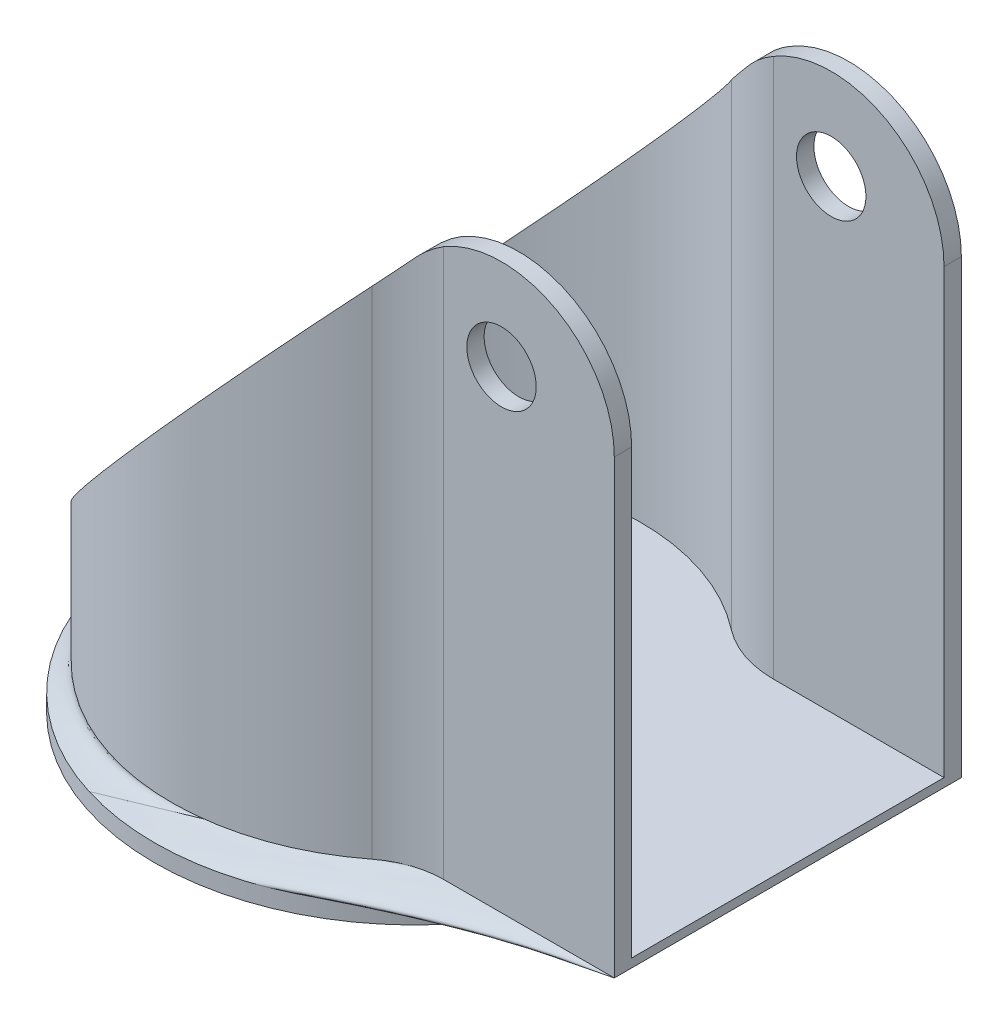
ISO-10303-21;
HEADER;
FILE_DESCRIPTION(('STEP AP214'),'2;1');
FILE_NAME('part.step','',(''),(''),'','','');
FILE_SCHEMA(('AUTOMOTIVE_DESIGN { 1 0 10303 214 1 1 1 1 }'));
ENDSEC;
DATA;
#1=APPLICATION_CONTEXT('core data for automotive mechanical design processes');
#2=APPLICATION_PROTOCOL_DEFINITION('international standard','automotive_design',2000,#1);
#3=PRODUCT_CONTEXT('',#1,'mechanical');
#4=PRODUCT('Part','Part','',(#3));
#5=PRODUCT_RELATED_PRODUCT_CATEGORY('part','',(#4));
#6=PRODUCT_DEFINITION_FORMATION('','',#4);
#7=PRODUCT_DEFINITION_CONTEXT('part definition',#1,'design');
#8=PRODUCT_DEFINITION('design','',#6,#7);
#9=PRODUCT_DEFINITION_SHAPE('','',#8);
#10=(LENGTH_UNIT() NAMED_UNIT(*) SI_UNIT(.MILLI.,.METRE.));
#11=(NAMED_UNIT(*) PLANE_ANGLE_UNIT() SI_UNIT($,.RADIAN.));
#12=(NAMED_UNIT(*) SI_UNIT($,.STERADIAN.) SOLID_ANGLE_UNIT());
#13=UNCERTAINTY_MEASURE_WITH_UNIT(LENGTH_MEASURE(1.E-05),#10,'distance_accuracy_value','');
#14=(GEOMETRIC_REPRESENTATION_CONTEXT(3) GLOBAL_UNCERTAINTY_ASSIGNED_CONTEXT((#13)) GLOBAL_UNIT_ASSIGNED_CONTEXT((#10,
#11,#12)) REPRESENTATION_CONTEXT('',''));
#15=CARTESIAN_POINT('',(0.,0.,0.));
#16=DIRECTION('',(0.,0.,1.));
#17=DIRECTION('',(1.,0.,0.));
#18=AXIS2_PLACEMENT_3D('',#15,#16,#17);
#19=CARTESIAN_POINT('',(30.0000000000002,57.0000000000002,-47.));
#20=DIRECTION('',(0.,0.,1.));
#21=DIRECTION('',(1.,0.,0.));
#22=AXIS2_PLACEMENT_3D('',#19,#20,#21);
#23=CYLINDRICAL_SURFACE('',#22,12.9999999999998);
#24=CARTESIAN_POINT('',(30.0000000000002,57.0000000000002,-18.));
#25=DIRECTION('',(0.,0.,-1.));
#26=DIRECTION('',(-1.,0.,0.));
#27=AXIS2_PLACEMENT_3D('',#24,#25,#26);
#28=CIRCLE('',#27,12.9999999999998);
#29=CARTESIAN_POINT('',(43.,57.0000000000002,-18.));
#30=VERTEX_POINT('',#29);
#31=CARTESIAN_POINT('',(23.3238075793812,68.154750322749,-18.));
#32=VERTEX_POINT('',#31);
#33=EDGE_CURVE('E240',#30,#32,#28,.F.);
#34=ORIENTED_EDGE('',*,*,#33,.F.);
#35=DIRECTION('',(0.,0.,1.));
#36=VECTOR('',#35,1.);
#37=CARTESIAN_POINT('',(43.,57.0000000000002,-47.));
#38=LINE('',#37,#36);
#39=CARTESIAN_POINT('',(43.,57.0000000000002,-20.));
#40=VERTEX_POINT('',#39);
#41=EDGE_CURVE('E243',#40,#30,#38,.T.);
#42=ORIENTED_EDGE('',*,*,#41,.F.);
#43=CARTESIAN_POINT('',(30.0000000000002,57.0000000000002,-20.));
#44=DIRECTION('',(0.,0.,1.));
#45=DIRECTION('',(1.,0.,0.));
#46=AXIS2_PLACEMENT_3D('',#43,#44,#45);
#47=CIRCLE('',#46,12.9999999999998);
#48=CARTESIAN_POINT('',(23.3238075793812,68.154750322749,-20.));
#49=VERTEX_POINT('',#48);
#50=EDGE_CURVE('E281',#49,#40,#47,.F.);
#51=ORIENTED_EDGE('',*,*,#50,.F.);
#52=CARTESIAN_POINT('',(20.3380966836966,65.6975642743472,-20.4561260251725));
#53=CARTESIAN_POINT('',(20.5524970602329,65.9357687621417,-20.3890470300889));
#54=CARTESIAN_POINT('',(20.7765289762126,66.1668912741178,-20.3269027138963));
#55=CARTESIAN_POINT('',(21.2409611029351,66.6115363948415,-20.2164288788429));
#56=CARTESIAN_POINT('',(21.4812140120493,66.8251864125114,-20.1679915247904));
#57=CARTESIAN_POINT('',(21.978774824642,67.2354225187706,-20.0876665412612));
#58=CARTESIAN_POINT('',(22.2360877927109,67.4320034997401,-20.0557838513717));
#59=CARTESIAN_POINT('',(22.6344047375489,67.7132979996968,-20.0228918922476));
#60=CARTESIAN_POINT('',(22.7698208811694,67.8051512779193,-20.0144129180655));
#61=CARTESIAN_POINT('',(23.0442172194368,67.9838020011142,-20.0029659002475));
#62=CARTESIAN_POINT('',(23.1831982336388,68.070598268213,-19.9999991355782));
#63=CARTESIAN_POINT('',(23.3238075793812,68.154750322749,-20.));
#64=B_SPLINE_CURVE_WITH_KNOTS('',3,(#52,#53,#54,#55,#56,#57,#58,#59,#60,#61,#62,#63),
.UNSPECIFIED.,.F.,.F.,(4,2,2,2,2,4),(0.,0.982230132643767,1.95650323326304,2.93106687106712,
3.42242947228087,3.91390606734185),.UNSPECIFIED.);
#65=CARTESIAN_POINT('',(20.3380966836966,65.6975642743472,-20.4561260251725));
#66=VERTEX_POINT('',#65);
#67=EDGE_CURVE('E310',#66,#49,#64,.T.);
#68=ORIENTED_EDGE('',*,*,#67,.F.);
#69=DIRECTION('',(0.,0.,1.));
#70=VECTOR('',#69,1.);
#71=CARTESIAN_POINT('',(20.3380966836966,65.6975642743472,-47.));
#72=LINE('',#71,#70);
#73=CARTESIAN_POINT('',(20.3380966836966,65.6975642743472,-18.3773698997434));
#74=VERTEX_POINT('',#73);
#75=EDGE_CURVE('E144',#66,#74,#72,.T.);
#76=ORIENTED_EDGE('',*,*,#75,.T.);
#77=CARTESIAN_POINT('',(23.3238075793812,68.154750322749,-18.));
#78=CARTESIAN_POINT('',(23.1836567373893,68.0708715796085,-17.9999989490713));
#79=CARTESIAN_POINT('',(23.0451164468122,67.9843637951381,-18.0024555349407));
#80=CARTESIAN_POINT('',(22.7715214130594,67.8062818677364,-18.0119346806309));
#81=CARTESIAN_POINT('',(22.6364661069004,67.7147085507284,-18.0189564980972));
#82=CARTESIAN_POINT('',(22.2388496240951,67.4340423946446,-18.0462106909953));
#83=CARTESIAN_POINT('',(21.9817344117881,67.237742665774,-18.0726426997475));
#84=CARTESIAN_POINT('',(21.484014047585,66.8276136973816,-18.1392147856673));
#85=CARTESIAN_POINT('',(21.2434054409978,66.6137881465514,-18.1793519838806));
#86=CARTESIAN_POINT('',(20.7780007200761,66.1683887998919,-18.2707394423202));
#87=CARTESIAN_POINT('',(20.553333664504,65.9366962276557,-18.3220691274884));
#88=CARTESIAN_POINT('',(20.3380966836966,65.6975642743472,-18.3773698997434));
#89=B_SPLINE_CURVE_WITH_KNOTS('',3,(#77,#78,#79,#80,#81,#82,#83,#84,#85,#86,#87,#88),
.UNSPECIFIED.,.F.,.F.,(4,2,2,2,2,4),(0.,0.489896124544593,0.97971260675667,1.9520167501121,
2.92411677377907,3.9033536264852),.UNSPECIFIED.);
#90=EDGE_CURVE('E246',#32,#74,#89,.T.);
#91=ORIENTED_EDGE('',*,*,#90,.F.);
#92=EDGE_LOOP('',(#34,#42,#51,#68,#76,#91));
#93=FACE_BOUND('',#92,.T.);
#94=ADVANCED_FACE('F125',(#93),#23,.T.);
#95=CARTESIAN_POINT('',(23.323807579381,70.,20.));
#96=DIRECTION('',(0.,0.,-1.));
#97=DIRECTION('',(-1.,0.,0.));
#98=AXIS2_PLACEMENT_3D('',#95,#96,#97);
#99=PLANE('',#98);
#100=CARTESIAN_POINT('',(30.0000000000002,59.5,20.));
#101=DIRECTION('',(0.,0.,1.));
#102=DIRECTION('',(1.,0.,0.));
#103=AXIS2_PLACEMENT_3D('',#100,#101,#102);
#104=CIRCLE('',#103,3.99999999999981);
#105=CARTESIAN_POINT('',(34.,59.5,20.));
#106=VERTEX_POINT('',#105);
#107=EDGE_CURVE('E398',#106,#106,#104,.T.);
#108=ORIENTED_EDGE('',*,*,#107,.F.);
#109=EDGE_LOOP('',(#108));
#110=FACE_BOUND('',#109,.T.);
#111=DIRECTION('',(0.,-1.,0.));
#112=VECTOR('',#111,1.);
#113=CARTESIAN_POINT('',(43.,70.,20.));
#114=LINE('',#113,#112);
#115=CARTESIAN_POINT('',(43.,57.0000000000002,20.));
#116=VERTEX_POINT('',#115);
#117=CARTESIAN_POINT('',(43.,5.,20.));
#118=VERTEX_POINT('',#117);
#119=EDGE_CURVE('E347',#116,#118,#114,.T.);
#120=ORIENTED_EDGE('',*,*,#119,.F.);
#121=CARTESIAN_POINT('',(30.0000000000002,57.0000000000002,20.));
#122=DIRECTION('',(0.,0.,-1.));
#123=DIRECTION('',(-1.,0.,0.));
#124=AXIS2_PLACEMENT_3D('',#121,#122,#123);
#125=CIRCLE('',#124,12.9999999999998);
#126=CARTESIAN_POINT('',(23.323807579381,68.1547503227489,20.));
#127=VERTEX_POINT('',#126);
#128=EDGE_CURVE('E311',#116,#127,#125,.F.);
#129=ORIENTED_EDGE('',*,*,#128,.T.);
#130=DIRECTION('',(0.,-1.,0.));
#131=VECTOR('',#130,1.);
#132=CARTESIAN_POINT('',(23.323807579381,70.,20.));
#133=LINE('',#132,#131);
#134=CARTESIAN_POINT('',(23.323807579381,5.,20.));
#135=VERTEX_POINT('',#134);
#136=EDGE_CURVE('E345',#127,#135,#133,.T.);
#137=ORIENTED_EDGE('',*,*,#136,.T.);
#138=DIRECTION('',(1.,0.,0.));
#139=VECTOR('',#138,1.);
#140=CARTESIAN_POINT('',(43.,5.,20.));
#141=LINE('',#140,#139);
#142=EDGE_CURVE('E363',#135,#118,#141,.T.);
#143=ORIENTED_EDGE('',*,*,#142,.T.);
#144=EDGE_LOOP('',(#120,#129,#137,#143));
#145=FACE_BOUND('',#144,.T.);
#146=ADVANCED_FACE('F324',(#110,#145),#99,.F.);
#147=CARTESIAN_POINT('',(43.,70.,20.));
#148=DIRECTION('',(-1.,0.,0.));
#149=DIRECTION('',(0.,0.,1.));
#150=AXIS2_PLACEMENT_3D('',#147,#148,#149);
#151=PLANE('',#150);
#152=ORIENTED_EDGE('',*,*,#41,.T.);
#153=DIRECTION('',(0.,1.,0.));
#154=VECTOR('',#153,1.);
#155=CARTESIAN_POINT('',(43.,63.9282032302757,-18.));
#156=LINE('',#155,#154);
#157=CARTESIAN_POINT('',(43.,6.00000000000001,-18.));
#158=VERTEX_POINT('',#157);
#159=EDGE_CURVE('E253',#158,#30,#156,.T.);
#160=ORIENTED_EDGE('',*,*,#159,.F.);
#161=DIRECTION('',(0.,0.,-1.));
#162=VECTOR('',#161,1.);
#163=CARTESIAN_POINT('',(43.,6.00000000000001,-18.));
#164=LINE('',#163,#162);
#165=CARTESIAN_POINT('',(43.,6.00000000000001,18.));
#166=VERTEX_POINT('',#165);
#167=EDGE_CURVE('E261',#166,#158,#164,.T.);
#168=ORIENTED_EDGE('',*,*,#167,.F.);
#169=DIRECTION('',(0.,-1.,0.));
#170=VECTOR('',#169,1.);
#171=CARTESIAN_POINT('',(43.,6.00000000000001,18.));
#172=LINE('',#171,#170);
#173=CARTESIAN_POINT('',(43.,57.0000000000002,18.));
#174=VERTEX_POINT('',#173);
#175=EDGE_CURVE('E260',#174,#166,#172,.T.);
#176=ORIENTED_EDGE('',*,*,#175,.F.);
#177=EDGE_CURVE('E267',#174,#116,#38,.T.);
#178=ORIENTED_EDGE('',*,*,#177,.T.);
#179=ORIENTED_EDGE('',*,*,#119,.T.);
#180=DIRECTION('',(0.,0.,-1.));
#181=VECTOR('',#180,1.);
#182=CARTESIAN_POINT('',(43.,5.,20.));
#183=LINE('',#182,#181);
#184=CARTESIAN_POINT('',(43.,5.,-20.));
#185=VERTEX_POINT('',#184);
#186=EDGE_CURVE('E355',#118,#185,#183,.T.);
#187=ORIENTED_EDGE('',*,*,#186,.T.);
#188=DIRECTION('',(0.,-1.,0.));
#189=VECTOR('',#188,1.);
#190=CARTESIAN_POINT('',(43.,70.,-20.));
#191=LINE('',#190,#189);
#192=EDGE_CURVE('E266',#40,#185,#191,.T.);
#193=ORIENTED_EDGE('',*,*,#192,.F.);
#194=EDGE_LOOP('',(#152,#160,#168,#176,#178,#179,#187,#193));
#195=FACE_BOUND('',#194,.T.);
#196=ADVANCED_FACE('F264',(#195),#151,.F.);
#197=CARTESIAN_POINT('',(43.,70.,-20.));
#198=DIRECTION('',(0.,0.,1.));
#199=DIRECTION('',(1.,0.,0.));
#200=AXIS2_PLACEMENT_3D('',#197,#198,#199);
#201=PLANE('',#200);
#202=CARTESIAN_POINT('',(30.0000000000002,59.5,-20.));
#203=DIRECTION('',(0.,0.,1.));
#204=DIRECTION('',(1.,0.,0.));
#205=AXIS2_PLACEMENT_3D('',#202,#203,#204);
#206=CIRCLE('',#205,3.99999999999981);
#207=CARTESIAN_POINT('',(34.,59.5,-20.));
#208=VERTEX_POINT('',#207);
#209=EDGE_CURVE('E629',#208,#208,#206,.T.);
#210=ORIENTED_EDGE('',*,*,#209,.T.);
#211=EDGE_LOOP('',(#210));
#212=FACE_BOUND('',#211,.T.);
#213=DIRECTION('',(0.,-1.,0.));
#214=VECTOR('',#213,1.);
#215=CARTESIAN_POINT('',(23.3238075793812,70.,-20.));
#216=LINE('',#215,#214);
#217=CARTESIAN_POINT('',(23.3238075793812,5.,-20.));
#218=VERTEX_POINT('',#217);
#219=EDGE_CURVE('E403',#49,#218,#216,.T.);
#220=ORIENTED_EDGE('',*,*,#219,.F.);
#221=ORIENTED_EDGE('',*,*,#50,.T.);
#222=ORIENTED_EDGE('',*,*,#192,.T.);
#223=DIRECTION('',(-1.,0.,0.));
#224=VECTOR('',#223,1.);
#225=CARTESIAN_POINT('',(43.,5.,-20.));
#226=LINE('',#225,#224);
#227=EDGE_CURVE('E464',#185,#218,#226,.T.);
#228=ORIENTED_EDGE('',*,*,#227,.T.);
#229=EDGE_LOOP('',(#220,#221,#222,#228));
#230=FACE_BOUND('',#229,.T.);
#231=ADVANCED_FACE('F452',(#212,#230),#201,.F.);
#232=CARTESIAN_POINT('',(41.,-84.8115558164098,-18.));
#233=DIRECTION('',(0.,0.,-1.));
#234=DIRECTION('',(-1.,0.,0.));
#235=AXIS2_PLACEMENT_3D('',#232,#233,#234);
#236=PLANE('',#235);
#237=CARTESIAN_POINT('',(30.0000000000002,59.5,-18.));
#238=DIRECTION('',(0.,0.,-1.));
#239=DIRECTION('',(-1.,0.,0.));
#240=AXIS2_PLACEMENT_3D('',#237,#238,#239);
#241=CIRCLE('',#240,3.99999999999981);
#242=CARTESIAN_POINT('',(26.0000000000004,59.5,-18.));
#243=VERTEX_POINT('',#242);
#244=EDGE_CURVE('E397',#243,#243,#241,.T.);
#245=ORIENTED_EDGE('',*,*,#244,.T.);
#246=EDGE_LOOP('',(#245));
#247=FACE_BOUND('',#246,.T.);
#248=DIRECTION('',(1.,0.,0.));
#249=VECTOR('',#248,1.);
#250=CARTESIAN_POINT('',(41.,6.00000000000001,-18.));
#251=LINE('',#250,#249);
#252=CARTESIAN_POINT('',(23.3238075793812,6.00000000000001,-18.));
#253=VERTEX_POINT('',#252);
#254=EDGE_CURVE('E256',#253,#158,#251,.T.);
#255=ORIENTED_EDGE('',*,*,#254,.T.);
#256=ORIENTED_EDGE('',*,*,#159,.T.);
#257=ORIENTED_EDGE('',*,*,#33,.T.);
#258=DIRECTION('',(0.,1.,0.));
#259=VECTOR('',#258,1.);
#260=CARTESIAN_POINT('',(23.3238075793812,-84.8115558164098,-18.));
#261=LINE('',#260,#259);
#262=EDGE_CURVE('E646',#253,#32,#261,.T.);
#263=ORIENTED_EDGE('',*,*,#262,.F.);
#264=EDGE_LOOP('',(#255,#256,#257,#263));
#265=FACE_BOUND('',#264,.T.);
#266=ADVANCED_FACE('F254',(#247,#265),#236,.F.);
#267=CARTESIAN_POINT('',(23.323807579381,-84.8115558164098,18.));
#268=DIRECTION('',(0.,0.,1.));
#269=DIRECTION('',(1.,0.,0.));
#270=AXIS2_PLACEMENT_3D('',#267,#268,#269);
#271=PLANE('',#270);
#272=CARTESIAN_POINT('',(30.0000000000002,59.5,18.));
#273=DIRECTION('',(0.,0.,1.));
#274=DIRECTION('',(1.,0.,0.));
#275=AXIS2_PLACEMENT_3D('',#272,#273,#274);
#276=CIRCLE('',#275,3.99999999999981);
#277=CARTESIAN_POINT('',(34.,59.5,18.));
#278=VERTEX_POINT('',#277);
#279=EDGE_CURVE('E394',#278,#278,#276,.T.);
#280=ORIENTED_EDGE('',*,*,#279,.T.);
#281=EDGE_LOOP('',(#280));
#282=FACE_BOUND('',#281,.T.);
#283=DIRECTION('',(0.,1.,0.));
#284=VECTOR('',#283,1.);
#285=CARTESIAN_POINT('',(23.323807579381,-84.8115558164098,18.));
#286=LINE('',#285,#284);
#287=CARTESIAN_POINT('',(23.323807579381,6.00000000000001,18.));
#288=VERTEX_POINT('',#287);
#289=CARTESIAN_POINT('',(23.323807579381,68.1547503227489,18.));
#290=VERTEX_POINT('',#289);
#291=EDGE_CURVE('E632',#288,#290,#286,.T.);
#292=ORIENTED_EDGE('',*,*,#291,.T.);
#293=CARTESIAN_POINT('',(30.0000000000002,57.0000000000002,18.));
#294=DIRECTION('',(0.,0.,1.));
#295=DIRECTION('',(1.,0.,0.));
#296=AXIS2_PLACEMENT_3D('',#293,#294,#295);
#297=CIRCLE('',#296,12.9999999999998);
#298=EDGE_CURVE('E136',#290,#174,#297,.F.);
#299=ORIENTED_EDGE('',*,*,#298,.T.);
#300=ORIENTED_EDGE('',*,*,#175,.T.);
#301=DIRECTION('',(-1.,0.,0.));
#302=VECTOR('',#301,1.);
#303=CARTESIAN_POINT('',(23.323807579381,6.00000000000001,18.));
#304=LINE('',#303,#302);
#305=EDGE_CURVE('E404',#166,#288,#304,.T.);
#306=ORIENTED_EDGE('',*,*,#305,.T.);
#307=EDGE_LOOP('',(#292,#299,#300,#306));
#308=FACE_BOUND('',#307,.T.);
#309=ADVANCED_FACE('F554',(#282,#308),#271,.F.);
#310=CARTESIAN_POINT('',(0.,2.,0.));
#311=DIRECTION('',(0.,-1.,0.));
#312=DIRECTION('',(0.,0.,-1.));
#313=AXIS2_PLACEMENT_3D('',#310,#311,#312);
#314=CYLINDRICAL_SURFACE('',#313,30.);
#315=CARTESIAN_POINT('',(20.6385286101872,2.,21.7727154210605));
#316=CARTESIAN_POINT('',(21.1069114025686,1.9999967695155,21.3287743520194));
#317=CARTESIAN_POINT('',(21.5609242023266,1.99997112346635,20.8696791666405));
#318=CARTESIAN_POINT('',(22.4384385253687,1.99991262947502,19.9231643174299));
#319=CARTESIAN_POINT('',(22.8619387747766,1.99987978123239,19.435743472556));
#320=CARTESIAN_POINT('',(23.6766305944913,1.99984451806615,18.4345821277172));
#321=CARTESIAN_POINT('',(24.0678211115046,1.9998421041343,17.9208407705906));
#322=CARTESIAN_POINT('',(24.815393705186,1.99989235367969,16.8704126057517));
#323=CARTESIAN_POINT('',(25.1718538185949,1.99994489041369,16.3337813260949));
#324=CARTESIAN_POINT('',(25.849478348367,2.00005308499189,15.2387330482142));
#325=CARTESIAN_POINT('',(26.1706458300146,2.0001087425644,14.6803179477063));
#326=CARTESIAN_POINT('',(26.7763329001326,2.00017925365555,13.5440942398429));
#327=CARTESIAN_POINT('',(27.0608578145972,2.00019411311059,12.9662884663453));
#328=CARTESIAN_POINT('',(27.6746274692136,2.0001429219598,11.6114746519007));
#329=CARTESIAN_POINT('',(27.9903492996494,2.00005033168782,10.8282932546574));
#330=CARTESIAN_POINT('',(28.5546306167619,1.99988971301073,9.23822727663455));
#331=CARTESIAN_POINT('',(28.8031956075415,1.99982168259257,8.43134464439648));
#332=CARTESIAN_POINT('',(29.2313819186252,1.99982559753617,6.79980145521425));
#333=CARTESIAN_POINT('',(29.4110293232653,1.99989748987643,5.97514774943444));
#334=CARTESIAN_POINT('',(29.7002307111012,2.00002899665847,4.31362949329095));
#335=CARTESIAN_POINT('',(29.8097835280744,2.00008861089595,3.47676473999873));
#336=CARTESIAN_POINT('',(29.9580200432756,2.00007539255169,1.79672141804074));
#337=CARTESIAN_POINT('',(29.9966987400759,2.00000255062354,0.953542408007458));
#338=CARTESIAN_POINT('',(30.0028962170715,1.99999834364561,-0.733077040533055));
#339=CARTESIAN_POINT('',(29.9704149758918,2.00006697863833,-1.57651747911873));
#340=CARTESIAN_POINT('',(29.8345059063687,2.00009086897016,-3.25788406757792));
#341=CARTESIAN_POINT('',(29.7310596079176,2.00004609478404,-4.09580872452158));
#342=CARTESIAN_POINT('',(29.4539383808078,1.9999187802873,-5.75995167611574));
#343=CARTESIAN_POINT('',(29.2802644206262,1.99983624049748,-6.5861701320384));
#344=CARTESIAN_POINT('',(28.8638950770561,1.99981216739309,-8.22114955535164));
#345=CARTESIAN_POINT('',(28.621190098666,1.99987065368896,-9.02990807906493));
#346=CARTESIAN_POINT('',(28.0684742599397,2.00002790950797,-10.6241488789166));
#347=CARTESIAN_POINT('',(27.7584594295471,2.00012668140755,-11.4096297789917));
#348=CARTESIAN_POINT('',(27.0735216288734,2.00020128280977,-12.951278523024));
#349=CARTESIAN_POINT('',(26.6986305549468,2.00017717256239,-13.7074605491955));
#350=CARTESIAN_POINT('',(25.8865358488253,2.00006559615334,-15.1854499033137));
#351=CARTESIAN_POINT('',(25.4493467034478,1.99997814470182,-15.9072651710032));
#352=CARTESIAN_POINT('',(24.6703871852089,1.99988190996921,-17.0789427819094));
#353=CARTESIAN_POINT('',(24.3449273532623,1.9998566692983,-17.5397437553378));
#354=CARTESIAN_POINT('',(23.6686056594756,1.9998440905068,-18.442205159054));
#355=CARTESIAN_POINT('',(23.3177490892267,1.99985674451264,-18.8838695461036));
#356=CARTESIAN_POINT('',(22.592202006359,1.99989893883841,-19.7461238671711));
#357=CARTESIAN_POINT('',(22.2175447407068,1.99992845604406,-20.1667417929068));
#358=CARTESIAN_POINT('',(21.4450836640818,1.99997797275445,-20.9863246895821));
#359=CARTESIAN_POINT('',(21.0472749910135,1.99999797025178,-21.3852850779084));
#360=CARTESIAN_POINT('',(20.6385286143832,2.,-21.7727154170831));
#361=B_SPLINE_CURVE_WITH_KNOTS('',3,(#315,#316,#317,#318,#319,#320,#321,#322,#323,#324,#325,
#326,#327,#328,#329,#330,#331,#332,#333,#334,#335,#336,#337,#338,#339,#340,#341,#342,#343,#344,
#345,#346,#347,#348,#349,#350,#351,#352,#353,#354,#355,#356,#357,#358,#359,#360),.UNSPECIFIED.,
.F.,.F.,(4,2,2,2,2,2,2,2,2,2,2,2,2,2,2,2,2,2,2,2,2,2,4),(0.,1.93568308827365,3.87144694309623,
5.80727387870067,7.73864567203558,9.66984958638858,11.6007724828395,14.1309146428023,
16.6608493720595,19.1898256096996,21.7188439229513,24.2480406964773,26.7772382297173,
29.3070942882205,31.8369154598434,34.3670884372364,36.8974106893501,39.4264924265918,
41.9549870070393,43.6466114721973,45.3378844843049,47.026844821845,48.716161151972),.UNSPECIFIED.);
#362=CARTESIAN_POINT('',(20.6385519370444,2.,21.7727400298412));
#363=VERTEX_POINT('',#362);
#364=CARTESIAN_POINT('',(20.6385583290229,2.,-21.7727467646857));
#365=VERTEX_POINT('',#364);
#366=EDGE_CURVE('E399',#363,#365,#361,.T.);
#367=ORIENTED_EDGE('',*,*,#366,.F.);
#368=CARTESIAN_POINT('',(0.,2.,0.));
#369=DIRECTION('',(0.,1.,0.));
#370=DIRECTION('',(0.,0.,1.));
#371=AXIS2_PLACEMENT_3D('',#368,#369,#370);
#372=CIRCLE('',#371,30.);
#373=CARTESIAN_POINT('',(-8.88685484436569,2.,28.6536954476507));
#374=VERTEX_POINT('',#373);
#375=EDGE_CURVE('E152',#374,#363,#372,.T.);
#376=ORIENTED_EDGE('',*,*,#375,.F.);
#377=EDGE_CURVE('E537',#365,#374,#372,.T.);
#378=ORIENTED_EDGE('',*,*,#377,.F.);
#379=EDGE_LOOP('',(#367,#376,#378));
#380=FACE_BOUND('',#379,.T.);
#381=CARTESIAN_POINT('',(0.,0.,0.));
#382=DIRECTION('',(0.,1.,0.));
#383=DIRECTION('',(0.,0.,1.));
#384=AXIS2_PLACEMENT_3D('',#381,#382,#383);
#385=CIRCLE('',#384,30.);
#386=CARTESIAN_POINT('',(0.,0.,30.));
#387=VERTEX_POINT('',#386);
#388=EDGE_CURVE('E385',#387,#387,#385,.T.);
#389=ORIENTED_EDGE('',*,*,#388,.T.);
#390=EDGE_LOOP('',(#389));
#391=FACE_BOUND('',#390,.T.);
#392=ADVANCED_FACE('F127',(#380,#391),#314,.T.);
#393=CARTESIAN_POINT('',(0.,0.,0.));
#394=DIRECTION('',(0.,1.,0.));
#395=DIRECTION('',(0.,0.,1.));
#396=AXIS2_PLACEMENT_3D('',#393,#394,#395);
#397=PLANE('',#396);
#398=ORIENTED_EDGE('',*,*,#388,.F.);
#399=EDGE_LOOP('',(#398));
#400=FACE_BOUND('',#399,.T.);
#401=ADVANCED_FACE('F491',(#400),#397,.F.);
#402=CARTESIAN_POINT('',(-8.88680323222086,2.,28.6535290725556));
#403=CARTESIAN_POINT('',(17.185963479544,5.,22.1052631578947));
#404=CARTESIAN_POINT('',(-8.25289266810883,2.,28.850134469253));
#405=CARTESIAN_POINT('',(17.6193037137746,5.,21.7683583499081));
#406=CARTESIAN_POINT('',(-6.97428043524823,2.,29.2005823997202));
#407=CARTESIAN_POINT('',(18.5437645353727,5.,21.1644360300766));
#408=CARTESIAN_POINT('',(-5.02924570834986,2.,29.5976187468163));
#409=CARTESIAN_POINT('',(20.0645230152562,5.,20.4976342474877));
#410=CARTESIAN_POINT('',(-3.06223423345898,2.,29.865319713202));
#411=CARTESIAN_POINT('',(21.6743943538667,5.,20.0906388611232));
#412=CARTESIAN_POINT('',(-1.73963030008314,2.,29.9568720447302));
#413=CARTESIAN_POINT('',(22.7749099493558,5.,20.));
#414=CARTESIAN_POINT('',(0.907168506355743,2.,30.051896721336));
#415=CARTESIAN_POINT('',(24.9652970595431,5.,20.));
#416=CARTESIAN_POINT('',(4.89074401378606,2.,29.7994704493632));
#417=CARTESIAN_POINT('',(28.2455614378581,4.99999999999999,20.));
#418=CARTESIAN_POINT('',(10.6772438931369,2.,28.2475654383203));
#419=CARTESIAN_POINT('',(33.1619037896906,5.00000000000001,20.));
#420=CARTESIAN_POINT('',(16.0434973006689,2.,25.5838623048648));
#421=CARTESIAN_POINT('',(38.0782461415231,4.99999999999999,20.));
#422=CARTESIAN_POINT('',(19.1980420508936,2.,23.138163986386));
#423=CARTESIAN_POINT('',(41.3585105198381,5.,20.));
#424=CARTESIAN_POINT('',(20.6385285986166,2.,21.7727154320284));
#425=CARTESIAN_POINT('',(43.,5.,20.));
#426=B_SPLINE_SURFACE_WITH_KNOTS('',3,1,((#402,#403),(#404,#405),(#406,#407),(#408,#409),(#410,
#411),(#412,#413),(#414,#415),(#416,#417),(#418,#419),(#420,#421),(#422,#423),(#424,#425)),
.UNSPECIFIED.,.F.,.F.,.F.,(4,1,1,1,2,1,1,1,4),(2,2),(0.,0.0626484733003613,0.125296946600723,
0.187945419901084,0.250593893201445,0.437945419901084,0.625296946600723,0.812648473300361,1.),
(0.,1.),.UNSPECIFIED.);
#427=DIRECTION('',(0.988075087818431,0.132559490842445,-0.0783300850260754));
#428=VECTOR('',#427,1.);
#429=CARTESIAN_POINT('',(31.8192642993083,3.5,20.8863577160142));
#430=LINE('',#429,#428);
#431=EDGE_CURVE('E513',#363,#118,#430,.T.);
#432=CARTESIAN_POINT('',(23.3238075793812,5.,30.));
#433=DIRECTION('',(0.,-1.,0.));
#434=DIRECTION('',(0.,0.,1.));
#435=AXIS2_PLACEMENT_3D('',#432,#433,#434);
#436=CIRCLE('',#435,10.);
#437=CARTESIAN_POINT('',(17.185963479544,5.,22.1052631578947));
#438=VERTEX_POINT('',#437);
#439=EDGE_CURVE('E374',#438,#135,#436,.T.);
#440=DIRECTION('',(-0.963895174393235,-0.110908272802321,0.242085620815116));
#441=VECTOR('',#440,1.);
#442=CARTESIAN_POINT('',(4.14958012366159,3.5,25.3793961152252));
#443=LINE('',#442,#441);
#444=EDGE_CURVE('E432',#438,#374,#443,.T.);
#445=ORIENTED_EDGE('',*,*,#375,.T.);
#446=ORIENTED_EDGE('',*,*,#431,.T.);
#447=ORIENTED_EDGE('',*,*,#142,.F.);
#448=ORIENTED_EDGE('',*,*,#439,.F.);
#449=ORIENTED_EDGE('',*,*,#444,.T.);
#450=EDGE_LOOP('',(#445,#446,#447,#448,#449));
#451=FACE_BOUND('',#450,.T.);
#452=ADVANCED_FACE('F479',(#451),#426,.T.);
#453=CARTESIAN_POINT('',(20.4149138846027,1.97,21.7904425863487));
#454=CARTESIAN_POINT('',(20.6385285986166,2.,21.7727154320284));
#455=CARTESIAN_POINT('',(43.,5.,20.));
#456=CARTESIAN_POINT('',(21.9239005649562,1.97,20.376728882931));
#457=CARTESIAN_POINT('',(22.1325748167883,2.,20.3564972438261));
#458=CARTESIAN_POINT('',(43.,5.,18.3333333333333));
#459=CARTESIAN_POINT('',(24.6147730097343,1.97,17.2734218499011));
#460=CARTESIAN_POINT('',(24.796804960133,2.,17.2509127226743));
#461=CARTESIAN_POINT('',(43.,5.,15.));
#462=CARTESIAN_POINT('',(27.5945602978757,1.97,11.9441763105625));
#463=CARTESIAN_POINT('',(27.7470894038373,2.,11.9249270401609));
#464=CARTESIAN_POINT('',(43.,5.,10.));
#465=CARTESIAN_POINT('',(29.4426075757521,1.97,6.15229018792698));
#466=CARTESIAN_POINT('',(29.5768391839129,2.,6.14088137418513));
#467=CARTESIAN_POINT('',(43.,5.,5.));
#468=CARTESIAN_POINT('',(30.083696212124,1.97,0.));
#469=CARTESIAN_POINT('',(30.2115804080435,2.,0.));
#470=CARTESIAN_POINT('',(43.,5.,0.));
#471=CARTESIAN_POINT('',(29.442607575752,1.97,-6.15229018792698));
#472=CARTESIAN_POINT('',(29.5768391839129,2.,-6.14088137418513));
#473=CARTESIAN_POINT('',(43.,5.,-5.));
#474=CARTESIAN_POINT('',(27.5945602978757,1.97,-11.9441763105625));
#475=CARTESIAN_POINT('',(27.7470894038374,2.,-11.9249270401609));
#476=CARTESIAN_POINT('',(43.,5.,-10.));
#477=CARTESIAN_POINT('',(24.6147730097342,1.97,-17.2734218499011));
#478=CARTESIAN_POINT('',(24.7968049601329,2.,-17.2509127226743));
#479=CARTESIAN_POINT('',(43.,5.,-15.));
#480=CARTESIAN_POINT('',(21.9239005649562,1.97,-20.376728882931));
#481=CARTESIAN_POINT('',(22.1325748167883,2.,-20.3564972438261));
#482=CARTESIAN_POINT('',(43.,5.,-18.3333333333333));
#483=CARTESIAN_POINT('',(20.4149138846027,1.97,-21.7904425863487));
#484=CARTESIAN_POINT('',(20.6385285986166,2.,-21.7727154320284));
#485=CARTESIAN_POINT('',(43.,5.,-20.));
#486=B_SPLINE_SURFACE_WITH_KNOTS('',3,1,((#453,#454,#455),(#456,#457,#458),(#459,#460,#461),
(#462,#463,#464),(#465,#466,#467),(#468,#469,#470),(#471,#472,#473),(#474,#475,#476),(#477,#478,
#479),(#480,#481,#482),(#483,#484,#485)),.UNSPECIFIED.,.F.,.F.,.F.,(4,1,1,1,1,1,1,1,4),(2,1,2),
(0.,0.125,0.25,0.375,0.5,0.625,0.75,0.875,1.),(-0.01,0.,1.),.UNSPECIFIED.);
#487=DIRECTION('',(0.988075087818431,0.132559490842445,0.0783300850260752));
#488=VECTOR('',#487,1.);
#489=CARTESIAN_POINT('',(31.8192642993083,3.5,-20.8863577160142));
#490=LINE('',#489,#488);
#491=EDGE_CURVE('E393',#365,#185,#490,.T.);
#492=ORIENTED_EDGE('',*,*,#366,.T.);
#493=ORIENTED_EDGE('',*,*,#491,.T.);
#494=ORIENTED_EDGE('',*,*,#186,.F.);
#495=ORIENTED_EDGE('',*,*,#431,.F.);
#496=EDGE_LOOP('',(#492,#493,#494,#495));
#497=FACE_BOUND('',#496,.T.);
#498=ADVANCED_FACE('F490',(#497),#486,.T.);
#499=CARTESIAN_POINT('',(20.6385285986166,2.,-21.7727154320284));
#500=CARTESIAN_POINT('',(43.,5.,-20.));
#501=CARTESIAN_POINT('',(20.089724759469,2.,-22.2929309175353));
#502=CARTESIAN_POINT('',(41.9066339314175,5.,-20.));
#503=CARTESIAN_POINT('',(18.9028830845143,2.,-23.3395638772519));
#504=CARTESIAN_POINT('',(39.9271018598828,5.,-20.));
#505=CARTESIAN_POINT('',(16.812411962039,2.00000000000001,-24.8962067828678));
#506=CARTESIAN_POINT('',(37.3429773671684,5.,-20.));
#507=CARTESIAN_POINT('',(14.3768769651738,1.99999999999999,-26.386740654327));
#508=CARTESIAN_POINT('',(34.9075999067388,5.,-20.));
#509=CARTESIAN_POINT('',(11.5896707630792,2.00000000000001,-27.7325348773676));
#510=CARTESIAN_POINT('',(32.5756979273201,5.,-20.));
#511=CARTESIAN_POINT('',(8.50180562012782,1.99999999999999,-28.8345619513089));
#512=CARTESIAN_POINT('',(30.3019998776382,5.,-20.));
#513=CARTESIAN_POINT('',(5.2408091559854,2.00000000000001,-29.601557140622));
#514=CARTESIAN_POINT('',(28.0387828015378,5.,-20.));
#515=CARTESIAN_POINT('',(1.98212564820825,2.,-29.9915452032423));
#516=CARTESIAN_POINT('',(25.7383237428635,5.,-20.));
#517=CARTESIAN_POINT('',(-0.0845950856182788,2.,-30.0162906849544));
#518=CARTESIAN_POINT('',(24.1445523194622,5.,-20.));
#519=CARTESIAN_POINT('',(-1.73963030008313,2.,-29.9568720447302));
#520=CARTESIAN_POINT('',(22.7749099493558,5.,-20.));
#521=CARTESIAN_POINT('',(-3.19994376048878,2.,-29.8592226943125));
#522=CARTESIAN_POINT('',(21.7457512312715,5.,-20.0876644480398));
#523=CARTESIAN_POINT('',(-5.10119788423944,2.,-29.5783628118252));
#524=CARTESIAN_POINT('',(20.5244385904856,5.,-20.3759472682102));
#525=CARTESIAN_POINT('',(-6.44234947501756,2.,-29.3058348492206));
#526=CARTESIAN_POINT('',(19.5492784982678,5.,-20.7285154711372));
#527=CARTESIAN_POINT('',(-7.35454886881228,2.,-29.0886991353608));
#528=CARTESIAN_POINT('',(18.8065797483693,5.,-21.0649759803089));
#529=CARTESIAN_POINT('',(-8.16934551814047,2.,-28.8700039659957));
#530=CARTESIAN_POINT('',(18.0357159688839,5.,-21.4961177303178));
#531=CARTESIAN_POINT('',(-8.65575692136316,2.,-28.725187369756));
#532=CARTESIAN_POINT('',(17.4845856330102,5.,-21.8730963030153));
#533=CARTESIAN_POINT('',(-10.4457007588909,2.,-28.170041836354));
#534=CARTESIAN_POINT('',(15.1711235231066,5.,-23.6717211394679));
#535=CARTESIAN_POINT('',(-13.4577501978982,2.,-26.9559349391993));
#536=CARTESIAN_POINT('',(10.6866606751624,4.99999999999999,-26.2687805974555));
#537=CARTESIAN_POINT('',(-17.5732796242758,2.,-24.4708569470514));
#538=CARTESIAN_POINT('',(3.07355485924604,5.00000000000001,-28.1989554271273));
#539=CARTESIAN_POINT('',(-21.2009564293848,2.,-21.3993409363256));
#540=CARTESIAN_POINT('',(-4.84441956718393,4.99999999999999,-27.9550626419494));
#541=CARTESIAN_POINT('',(-24.2795534274059,2.,-17.8292123159837));
#542=CARTESIAN_POINT('',(-12.4361771198638,5.,-25.5058520243822));
#543=CARTESIAN_POINT('',(-26.7478434325197,2.,-13.8482964949875));
#544=CARTESIAN_POINT('',(-19.0761309822391,5.00000000000002,-21.0115645266982));
#545=CARTESIAN_POINT('',(-28.56635634146,2.,-9.55153608244492));
#546=CARTESIAN_POINT('',(-24.2069134943816,4.99999999999998,-14.8158969833538));
#547=CARTESIAN_POINT('',(-29.6956220509606,2.,-5.03387368746408));
#548=CARTESIAN_POINT('',(-27.3946725885492,5.00000000000004,-7.41828726453636));
#549=CARTESIAN_POINT('',(-30.1183087809555,2.,-0.395393958116252));
#550=CARTESIAN_POINT('',(-28.3745515025361,4.99999999999996,0.57268068843971));
#551=CARTESIAN_POINT('',(-29.817084751379,2.,4.26381845752732));
#552=CARTESIAN_POINT('',(-27.0753798797024,5.00000000000003,8.49776598009088));
#553=CARTESIAN_POINT('',(-28.7966544761563,2.,8.84075287856983));
#554=CARTESIAN_POINT('',(-23.6265570429247,4.99999999999997,15.7116380400247));
#555=CARTESIAN_POINT('',(-27.0617224692124,2.,13.2323986241145));
#556=CARTESIAN_POINT('',(-18.338969114515,5.00000000000003,21.6438280482473));
#557=CARTESIAN_POINT('',(-24.6408269700191,2.,17.3348177775584));
#558=CARTESIAN_POINT('',(-11.6707902919525,4.99999999999996,25.8497038671069));
#559=CARTESIAN_POINT('',(-21.5625062180479,2.,21.0440724222987));
#560=CARTESIAN_POINT('',(-4.17715652674161,5.00000000000004,28.0454776272493));
#561=CARTESIAN_POINT('',(-17.8804182566743,2.,24.2572045849913));
#562=CARTESIAN_POINT('',(3.54456898038328,4.99999999999997,28.1240972282292));
#563=CARTESIAN_POINT('',(-13.6482211292736,2.,26.871256292292));
#564=CARTESIAN_POINT('',(10.9116142080931,5.00000000000002,26.1527637689608));
#565=CARTESIAN_POINT('',(-10.5163035623448,2.,28.1481445956913));
#566=CARTESIAN_POINT('',(15.2384743883882,5.,23.6193585187301));
#567=CARTESIAN_POINT('',(-8.88680323222086,2.,28.6535290725556));
#568=CARTESIAN_POINT('',(17.185963479544,5.,22.1052631578947));
#569=B_SPLINE_SURFACE_WITH_KNOTS('',3,1,((#499,#500),(#501,#502),(#503,#504),(#505,#506),(#507,
#508),(#509,#510),(#511,#512),(#513,#514),(#515,#516),(#517,#518),(#519,#520),(#521,#522),(#523,
#524),(#525,#526),(#527,#528),(#529,#530),(#531,#532),(#533,#534),(#535,#536),(#537,#538),(#539,
#540),(#541,#542),(#543,#544),(#545,#546),(#547,#548),(#549,#550),(#551,#552),(#553,#554),(#555,
#556),(#557,#558),(#559,#560),(#561,#562),(#563,#564),(#565,#566),(#567,#568)),.UNSPECIFIED.,
.F.,.F.,.F.,(4,1,1,1,1,1,1,1,2,1,1,1,1,1,2,1,1,1,1,1,1,1,1,1,1,1,1,1,1,1,4),(2,2),(0.,
0.0213794732791969,0.0427589465583938,0.0641384198375906,0.0855178931167875,0.106897366395984,
0.128276839675181,0.149656312954378,0.171035786233575,0.185333949525886,0.199632112818196,
0.206781194464351,0.213930276110507,0.221079357756662,0.228228439402817,0.276464161940141,
0.324699884477465,0.372935607014789,0.421171329552113,0.469407052089437,0.517642774626761,
0.565878497164085,0.614114219701409,0.662349942238733,0.710585664776056,0.75882138731338,
0.807057109850704,0.855292832388028,0.903528554925352,0.951764277462676,1.),(0.,1.),.UNSPECIFIED.);
#570=CARTESIAN_POINT('',(0.,5.,0.));
#571=DIRECTION('',(0.,1.,0.));
#572=DIRECTION('',(0.,0.,1.));
#573=AXIS2_PLACEMENT_3D('',#570,#571,#572);
#574=CIRCLE('',#573,28.);
#575=CARTESIAN_POINT('',(17.1859634790978,5.,-22.1052631582417));
#576=VERTEX_POINT('',#575);
#577=EDGE_CURVE('E387',#576,#438,#574,.T.);
#578=CARTESIAN_POINT('',(23.3238075793812,5.,-30.));
#579=DIRECTION('',(0.,-1.,0.));
#580=DIRECTION('',(0.,0.,-1.));
#581=AXIS2_PLACEMENT_3D('',#578,#579,#580);
#582=CIRCLE('',#581,10.);
#583=EDGE_CURVE('E390',#218,#576,#582,.T.);
#584=CARTESIAN_POINT('',(20.6385285986166,2.,-21.7727154320284));
#585=CARTESIAN_POINT('',(43.,5.,-20.));
#586=CARTESIAN_POINT('',(20.089724759469,2.,-22.2929309175353));
#587=CARTESIAN_POINT('',(41.9066339314175,5.,-20.));
#588=CARTESIAN_POINT('',(18.9028830845143,2.,-23.3395638772519));
#589=CARTESIAN_POINT('',(39.9271018598828,5.,-20.));
#590=CARTESIAN_POINT('',(16.812411962039,2.00000000000001,-24.8962067828678));
#591=CARTESIAN_POINT('',(37.3429773671684,5.,-20.));
#592=CARTESIAN_POINT('',(14.3768769651738,1.99999999999999,-26.386740654327));
#593=CARTESIAN_POINT('',(34.9075999067388,5.,-20.));
#594=CARTESIAN_POINT('',(11.5896707630792,2.00000000000001,-27.7325348773676));
#595=CARTESIAN_POINT('',(32.5756979273201,5.,-20.));
#596=CARTESIAN_POINT('',(8.50180562012782,1.99999999999999,-28.8345619513089));
#597=CARTESIAN_POINT('',(30.3019998776382,5.,-20.));
#598=CARTESIAN_POINT('',(5.2408091559854,2.00000000000001,-29.601557140622));
#599=CARTESIAN_POINT('',(28.0387828015378,5.,-20.));
#600=CARTESIAN_POINT('',(1.98212564820825,2.,-29.9915452032423));
#601=CARTESIAN_POINT('',(25.7383237428635,5.,-20.));
#602=CARTESIAN_POINT('',(-0.0845950856182788,2.,-30.0162906849544));
#603=CARTESIAN_POINT('',(24.1445523194622,5.,-20.));
#604=CARTESIAN_POINT('',(-1.73963030008313,2.,-29.9568720447302));
#605=CARTESIAN_POINT('',(22.7749099493558,5.,-20.));
#606=CARTESIAN_POINT('',(-3.19994376048878,2.,-29.8592226943125));
#607=CARTESIAN_POINT('',(21.7457512312715,5.,-20.0876644480398));
#608=CARTESIAN_POINT('',(-5.10119788423944,2.,-29.5783628118252));
#609=CARTESIAN_POINT('',(20.5244385904856,5.,-20.3759472682102));
#610=CARTESIAN_POINT('',(-6.44234947501756,2.,-29.3058348492206));
#611=CARTESIAN_POINT('',(19.5492784982678,5.,-20.7285154711372));
#612=CARTESIAN_POINT('',(-7.35454886881228,2.,-29.0886991353608));
#613=CARTESIAN_POINT('',(18.8065797483693,5.,-21.0649759803089));
#614=CARTESIAN_POINT('',(-8.16934551814047,2.,-28.8700039659957));
#615=CARTESIAN_POINT('',(18.0357159688839,5.,-21.4961177303178));
#616=CARTESIAN_POINT('',(-8.65575692136316,2.,-28.725187369756));
#617=CARTESIAN_POINT('',(17.4845856330102,5.,-21.8730963030153));
#618=CARTESIAN_POINT('',(-10.4457007588909,2.,-28.170041836354));
#619=CARTESIAN_POINT('',(15.1711235231066,5.,-23.6717211394679));
#620=CARTESIAN_POINT('',(-13.4577501978982,2.,-26.9559349391993));
#621=CARTESIAN_POINT('',(10.6866606751624,4.99999999999999,-26.2687805974555));
#622=CARTESIAN_POINT('',(-17.5732796242758,2.,-24.4708569470514));
#623=CARTESIAN_POINT('',(3.07355485924604,5.00000000000001,-28.1989554271273));
#624=CARTESIAN_POINT('',(-21.2009564293848,2.,-21.3993409363256));
#625=CARTESIAN_POINT('',(-4.84441956718393,4.99999999999999,-27.9550626419494));
#626=CARTESIAN_POINT('',(-24.2795534274059,2.,-17.8292123159837));
#627=CARTESIAN_POINT('',(-12.4361771198638,5.,-25.5058520243822));
#628=CARTESIAN_POINT('',(-26.7478434325197,2.,-13.8482964949875));
#629=CARTESIAN_POINT('',(-19.0761309822391,5.00000000000002,-21.0115645266982));
#630=CARTESIAN_POINT('',(-28.56635634146,2.,-9.55153608244492));
#631=CARTESIAN_POINT('',(-24.2069134943816,4.99999999999998,-14.8158969833538));
#632=CARTESIAN_POINT('',(-29.6956220509606,2.,-5.03387368746408));
#633=CARTESIAN_POINT('',(-27.3946725885492,5.00000000000004,-7.41828726453636));
#634=CARTESIAN_POINT('',(-30.1183087809555,2.,-0.395393958116252));
#635=CARTESIAN_POINT('',(-28.3745515025361,4.99999999999996,0.57268068843971));
#636=CARTESIAN_POINT('',(-29.817084751379,2.,4.26381845752732));
#637=CARTESIAN_POINT('',(-27.0753798797024,5.00000000000003,8.49776598009088));
#638=CARTESIAN_POINT('',(-28.7966544761563,2.,8.84075287856983));
#639=CARTESIAN_POINT('',(-23.6265570429247,4.99999999999997,15.7116380400247));
#640=CARTESIAN_POINT('',(-27.0617224692124,2.,13.2323986241145));
#641=CARTESIAN_POINT('',(-18.338969114515,5.00000000000003,21.6438280482473));
#642=CARTESIAN_POINT('',(-24.6408269700191,2.,17.3348177775584));
#643=CARTESIAN_POINT('',(-11.6707902919525,4.99999999999996,25.8497038671069));
#644=CARTESIAN_POINT('',(-21.5625062180479,2.,21.0440724222987));
#645=CARTESIAN_POINT('',(-4.17715652674161,5.00000000000004,28.0454776272493));
#646=CARTESIAN_POINT('',(-17.8804182566743,2.,24.2572045849913));
#647=CARTESIAN_POINT('',(3.54456898038328,4.99999999999997,28.1240972282292));
#648=CARTESIAN_POINT('',(-13.6482211292736,2.,26.871256292292));
#649=CARTESIAN_POINT('',(10.9116142080931,5.00000000000002,26.1527637689608));
#650=CARTESIAN_POINT('',(-10.5163035623448,2.,28.1481445956913));
#651=CARTESIAN_POINT('',(15.2384743883882,5.,23.6193585187301));
#652=CARTESIAN_POINT('',(-8.88680323222086,2.,28.6535290725556));
#653=CARTESIAN_POINT('',(17.185963479544,5.,22.1052631578947));
#654=CARTESIAN_POINT('',(-8.88669512974448,2.,28.6535626002036));
#655=CARTESIAN_POINT('',(17.1860926776728,5.,22.1051627114849));
#656=CARTESIAN_POINT('',(-8.88658702726809,2.,28.6535961278516));
#657=CARTESIAN_POINT('',(17.1862218758016,5.,22.1050622650751));
#658=CARTESIAN_POINT('',(-8.88647892479171,2.,28.6536296554996));
#659=CARTESIAN_POINT('',(17.1863510739303,5.,22.1049618186652));
#660=B_SPLINE_SURFACE_WITH_KNOTS('',3,1,((#584,#585),(#586,#587),(#588,#589),(#590,#591),(#592,
#593),(#594,#595),(#596,#597),(#598,#599),(#600,#601),(#602,#603),(#604,#605),(#606,#607),(#608,
#609),(#610,#611),(#612,#613),(#614,#615),(#616,#617),(#618,#619),(#620,#621),(#622,#623),(#624,
#625),(#626,#627),(#628,#629),(#630,#631),(#632,#633),(#634,#635),(#636,#637),(#638,#639),(#640,
#641),(#642,#643),(#644,#645),(#646,#647),(#648,#649),(#650,#651),(#652,#653),(#654,#655),(#656,
#657),(#658,#659)),.UNSPECIFIED.,.F.,.F.,.F.,(4,1,1,1,1,1,1,1,2,1,1,1,1,1,2,1,1,1,1,1,1,1,1,1,1,
1,1,1,1,1,3,4),(2,2),(0.,0.0213794732791969,0.0427589465583938,0.0641384198375906,
0.0855178931167875,0.106897366395984,0.128276839675181,0.149656312954378,0.171035786233575,
0.185333949525886,0.199632112818196,0.206781194464351,0.213930276110507,0.221079357756662,
0.228228439402817,0.276464161940141,0.324699884477465,0.372935607014789,0.421171329552113,
0.469407052089437,0.517642774626761,0.565878497164085,0.614114219701409,0.662349942238733,
0.710585664776056,0.75882138731338,0.807057109850704,0.855292832388028,0.903528554925352,
0.951764277462676,1.,1.0000032),(0.,1.),.UNSPECIFIED.);
#661=ORIENTED_EDGE('',*,*,#377,.T.);
#662=ORIENTED_EDGE('',*,*,#444,.F.);
#663=ORIENTED_EDGE('',*,*,#577,.F.);
#664=ORIENTED_EDGE('',*,*,#583,.F.);
#665=ORIENTED_EDGE('',*,*,#227,.F.);
#666=ORIENTED_EDGE('',*,*,#491,.F.);
#667=EDGE_LOOP('',(#661,#662,#663,#664,#665,#666));
#668=FACE_BOUND('',#667,.T.);
#669=ADVANCED_FACE('F428',(#668),#660,.T.);
#670=CARTESIAN_POINT('',(0.,70.,0.));
#671=DIRECTION('',(0.,-1.,0.));
#672=DIRECTION('',(0.,0.,-1.));
#673=AXIS2_PLACEMENT_3D('',#670,#671,#672);
#674=CYLINDRICAL_SURFACE('',#673,28.);
#675=DIRECTION('',(0.,-1.,0.));
#676=VECTOR('',#675,1.);
#677=CARTESIAN_POINT('',(17.185963479544,70.,22.1052631578947));
#678=LINE('',#677,#676);
#679=CARTESIAN_POINT('',(17.185963479544,62.1959395322962,22.1052631578947));
#680=VERTEX_POINT('',#679);
#681=EDGE_CURVE('E130',#680,#438,#678,.T.);
#682=ORIENTED_EDGE('',*,*,#681,.F.);
#683=CARTESIAN_POINT('',(0.,43.1044890641884,0.));
#684=DIRECTION('',(0.743223332023364,-0.669043405719007,0.));
#685=DIRECTION('',(-0.669043405719007,-0.743223332023364,0.));
#686=AXIS2_PLACEMENT_3D('',#683,#684,#685);
#687=ELLIPSE('',#686,41.8507973633026,28.);
#688=CARTESIAN_POINT('',(17.1859634790978,62.1959395318004,-22.1052631582417));
#689=VERTEX_POINT('',#688);
#690=EDGE_CURVE('E621',#680,#689,#687,.T.);
#691=ORIENTED_EDGE('',*,*,#690,.T.);
#692=DIRECTION('',(0.,-1.,0.));
#693=VECTOR('',#692,1.);
#694=CARTESIAN_POINT('',(17.1859634790978,70.,-22.1052631582417));
#695=LINE('',#694,#693);
#696=EDGE_CURVE('E401',#689,#576,#695,.T.);
#697=ORIENTED_EDGE('',*,*,#696,.T.);
#698=ORIENTED_EDGE('',*,*,#577,.T.);
#699=EDGE_LOOP('',(#682,#691,#697,#698));
#700=FACE_BOUND('',#699,.T.);
#701=ADVANCED_FACE('F322',(#700),#674,.T.);
#702=CARTESIAN_POINT('',(23.3238075793812,70.,30.));
#703=DIRECTION('',(0.,-1.,0.));
#704=DIRECTION('',(0.,0.,-1.));
#705=AXIS2_PLACEMENT_3D('',#702,#703,#704);
#706=CYLINDRICAL_SURFACE('',#705,9.99999999999999);
#707=ORIENTED_EDGE('',*,*,#136,.F.);
#708=CARTESIAN_POINT('',(23.323807579381,68.1547503227489,20.));
#709=CARTESIAN_POINT('',(23.1831982336386,68.0705982682128,19.9999991355782));
#710=CARTESIAN_POINT('',(23.0442172194366,67.9838020011141,20.0029659002475));
#711=CARTESIAN_POINT('',(22.7698208811692,67.8051512779192,20.0144129180655));
#712=CARTESIAN_POINT('',(22.6344047375487,67.7132979996967,20.0228918922476));
#713=CARTESIAN_POINT('',(22.2360877927108,67.43200349974,20.0557838513717));
#714=CARTESIAN_POINT('',(21.9787748246418,67.2354225187705,20.0876665412612));
#715=CARTESIAN_POINT('',(21.4812140120493,66.8251864125113,20.1679915247905));
#716=CARTESIAN_POINT('',(21.2409611029351,66.6115363948415,20.2164288788429));
#717=CARTESIAN_POINT('',(20.7765289762126,66.1668912741177,20.3269027138963));
#718=CARTESIAN_POINT('',(20.5524970602329,65.9357687621417,20.3890470300889));
#719=CARTESIAN_POINT('',(20.3380966836966,65.6975642743472,20.4561260251725));
#720=B_SPLINE_CURVE_WITH_KNOTS('',3,(#708,#709,#710,#711,#712,#713,#714,#715,#716,#717,#718,
#719),.UNSPECIFIED.,.F.,.F.,(4,2,2,2,2,4),(0.,0.491476595060954,0.982839196274687,
1.95740283407871,2.93167593469792,3.91390606734162),.UNSPECIFIED.);
#721=CARTESIAN_POINT('',(20.3380966836966,65.6975642743472,20.4561260251725));
#722=VERTEX_POINT('',#721);
#723=EDGE_CURVE('E304',#127,#722,#720,.T.);
#724=ORIENTED_EDGE('',*,*,#723,.T.);
#725=CARTESIAN_POINT('',(23.3238075793812,69.0143146994775,30.));
#726=DIRECTION('',(0.743223332023364,-0.669043405719007,0.));
#727=DIRECTION('',(-0.669043405719007,-0.743223332023364,0.));
#728=AXIS2_PLACEMENT_3D('',#725,#726,#727);
#729=ELLIPSE('',#728,14.9467133440366,9.99999999999999);
#730=EDGE_CURVE('E619',#722,#680,#729,.F.);
#731=ORIENTED_EDGE('',*,*,#730,.T.);
#732=ORIENTED_EDGE('',*,*,#681,.T.);
#733=ORIENTED_EDGE('',*,*,#439,.T.);
#734=EDGE_LOOP('',(#707,#724,#731,#732,#733));
#735=FACE_BOUND('',#734,.T.);
#736=ADVANCED_FACE('F316',(#735),#706,.F.);
#737=CARTESIAN_POINT('',(23.3238075793812,70.,-30.));
#738=DIRECTION('',(0.,-1.,0.));
#739=DIRECTION('',(0.,0.,-1.));
#740=AXIS2_PLACEMENT_3D('',#737,#738,#739);
#741=CYLINDRICAL_SURFACE('',#740,10.);
#742=CARTESIAN_POINT('',(23.3238075793812,69.0143146994775,-30.));
#743=DIRECTION('',(0.743223332023364,-0.669043405719007,0.));
#744=DIRECTION('',(-0.669043405719007,-0.743223332023364,0.));
#745=AXIS2_PLACEMENT_3D('',#742,#743,#744);
#746=ELLIPSE('',#745,14.9467133440366,10.);
#747=EDGE_CURVE('E574',#689,#66,#746,.F.);
#748=ORIENTED_EDGE('',*,*,#747,.T.);
#749=ORIENTED_EDGE('',*,*,#67,.T.);
#750=ORIENTED_EDGE('',*,*,#219,.T.);
#751=ORIENTED_EDGE('',*,*,#583,.T.);
#752=ORIENTED_EDGE('',*,*,#696,.F.);
#753=EDGE_LOOP('',(#748,#749,#750,#751,#752));
#754=FACE_BOUND('',#753,.T.);
#755=ADVANCED_FACE('F321',(#754),#741,.F.);
#756=CARTESIAN_POINT('',(23.3238075793812,-84.8115558164098,30.));
#757=DIRECTION('',(0.,1.,0.));
#758=DIRECTION('',(0.,0.,1.));
#759=AXIS2_PLACEMENT_3D('',#756,#757,#758);
#760=CYLINDRICAL_SURFACE('',#759,12.);
#761=CARTESIAN_POINT('',(23.3238075793812,69.0143146994775,30.));
#762=DIRECTION('',(0.743223332023364,-0.669043405719007,0.));
#763=DIRECTION('',(0.669043405719007,0.743223332023364,0.));
#764=AXIS2_PLACEMENT_3D('',#761,#762,#763);
#765=ELLIPSE('',#764,17.936056012844,12.);
#766=CARTESIAN_POINT('',(15.9583946595766,60.8322644988599,20.5263157894737));
#767=VERTEX_POINT('',#766);
#768=CARTESIAN_POINT('',(20.3380966836966,65.6975642743472,18.3773698997434));
#769=VERTEX_POINT('',#768);
#770=EDGE_CURVE('E573',#767,#769,#765,.T.);
#771=ORIENTED_EDGE('',*,*,#770,.T.);
#772=CARTESIAN_POINT('',(20.3380966836966,65.6975642743472,18.3773698997434));
#773=CARTESIAN_POINT('',(20.553333664504,65.9366962276556,18.3220691274884));
#774=CARTESIAN_POINT('',(20.7780007200761,66.1683887998919,18.2707394423202));
#775=CARTESIAN_POINT('',(21.2434054409978,66.6137881465513,18.1793519838806));
#776=CARTESIAN_POINT('',(21.4840140475849,66.8276136973816,18.1392147856673));
#777=CARTESIAN_POINT('',(21.981734411788,67.2377426657739,18.0726426997475));
#778=CARTESIAN_POINT('',(22.238849624095,67.4340423946445,18.0462106909953));
#779=CARTESIAN_POINT('',(22.6364661069003,67.7147085507283,18.0189564980972));
#780=CARTESIAN_POINT('',(22.7715214130593,67.8062818677363,18.0119346806309));
#781=CARTESIAN_POINT('',(23.045116446812,67.984363795138,18.0024555349407));
#782=CARTESIAN_POINT('',(23.1836567373891,68.0708715796084,17.9999989490713));
#783=CARTESIAN_POINT('',(23.323807579381,68.1547503227489,18.));
#784=B_SPLINE_CURVE_WITH_KNOTS('',3,(#772,#773,#774,#775,#776,#777,#778,#779,#780,#781,#782,
#783),.UNSPECIFIED.,.F.,.F.,(4,2,2,2,2,4),(0.,0.979236852706079,1.95133687637298,
2.92364101972836,3.41345750194041,3.90335362648497),.UNSPECIFIED.);
#785=EDGE_CURVE('E250',#769,#290,#784,.T.);
#786=ORIENTED_EDGE('',*,*,#785,.T.);
#787=ORIENTED_EDGE('',*,*,#291,.F.);
#788=CARTESIAN_POINT('',(23.3238075793812,6.00000000000001,30.));
#789=DIRECTION('',(0.,1.,0.));
#790=DIRECTION('',(0.,0.,1.));
#791=AXIS2_PLACEMENT_3D('',#788,#789,#790);
#792=CIRCLE('',#791,12.);
#793=CARTESIAN_POINT('',(15.9583946595766,6.00000000000001,20.5263157894737));
#794=VERTEX_POINT('',#793);
#795=EDGE_CURVE('E639',#288,#794,#792,.T.);
#796=ORIENTED_EDGE('',*,*,#795,.T.);
#797=DIRECTION('',(0.,1.,0.));
#798=VECTOR('',#797,1.);
#799=CARTESIAN_POINT('',(15.9583946595766,-84.8115558164098,20.5263157894737));
#800=LINE('',#799,#798);
#801=EDGE_CURVE('E635',#794,#767,#800,.T.);
#802=ORIENTED_EDGE('',*,*,#801,.T.);
#803=EDGE_LOOP('',(#771,#786,#787,#796,#802));
#804=FACE_BOUND('',#803,.T.);
#805=ADVANCED_FACE('F283',(#804),#760,.T.);
#806=CARTESIAN_POINT('',(0.,-84.8115558164098,0.));
#807=DIRECTION('',(0.,1.,0.));
#808=DIRECTION('',(0.,0.,1.));
#809=AXIS2_PLACEMENT_3D('',#806,#807,#808);
#810=CYLINDRICAL_SURFACE('',#809,26.);
#811=DIRECTION('',(0.,1.,0.));
#812=VECTOR('',#811,1.);
#813=CARTESIAN_POINT('',(15.9583946590411,-84.8115558164098,-20.52631578989));
#814=LINE('',#813,#812);
#815=CARTESIAN_POINT('',(15.9583946590411,6.00000000000001,-20.52631578989));
#816=VERTEX_POINT('',#815);
#817=CARTESIAN_POINT('',(15.9583946590411,60.832264498265,-20.52631578989));
#818=VERTEX_POINT('',#817);
#819=EDGE_CURVE('E643',#816,#818,#814,.T.);
#820=ORIENTED_EDGE('',*,*,#819,.T.);
#821=CARTESIAN_POINT('',(0.,43.1044890641884,0.));
#822=DIRECTION('',(0.743223332023364,-0.669043405719007,0.));
#823=DIRECTION('',(0.669043405719007,0.743223332023364,0.));
#824=AXIS2_PLACEMENT_3D('',#821,#822,#823);
#825=ELLIPSE('',#824,38.8614546944952,26.);
#826=EDGE_CURVE('E571',#818,#767,#825,.F.);
#827=ORIENTED_EDGE('',*,*,#826,.T.);
#828=ORIENTED_EDGE('',*,*,#801,.F.);
#829=CARTESIAN_POINT('',(0.,6.00000000000001,0.));
#830=DIRECTION('',(0.,1.,0.));
#831=DIRECTION('',(0.,0.,1.));
#832=AXIS2_PLACEMENT_3D('',#829,#830,#831);
#833=CIRCLE('',#832,26.);
#834=EDGE_CURVE('E637',#794,#816,#833,.F.);
#835=ORIENTED_EDGE('',*,*,#834,.T.);
#836=EDGE_LOOP('',(#820,#827,#828,#835));
#837=FACE_BOUND('',#836,.T.);
#838=ADVANCED_FACE('F657',(#837),#810,.F.);
#839=CARTESIAN_POINT('',(23.3238075793812,-84.8115558164098,-30.));
#840=DIRECTION('',(0.,1.,0.));
#841=DIRECTION('',(0.,0.,1.));
#842=AXIS2_PLACEMENT_3D('',#839,#840,#841);
#843=CYLINDRICAL_SURFACE('',#842,12.);
#844=ORIENTED_EDGE('',*,*,#262,.T.);
#845=ORIENTED_EDGE('',*,*,#90,.T.);
#846=CARTESIAN_POINT('',(23.3238075793812,69.0143146994775,-30.));
#847=DIRECTION('',(0.743223332023364,-0.669043405719007,0.));
#848=DIRECTION('',(0.669043405719007,0.743223332023364,0.));
#849=AXIS2_PLACEMENT_3D('',#846,#847,#848);
#850=ELLIPSE('',#849,17.936056012844,12.);
#851=EDGE_CURVE('E13',#74,#818,#850,.T.);
#852=ORIENTED_EDGE('',*,*,#851,.T.);
#853=ORIENTED_EDGE('',*,*,#819,.F.);
#854=CARTESIAN_POINT('',(23.3238075793812,6.00000000000001,-30.));
#855=DIRECTION('',(0.,1.,0.));
#856=DIRECTION('',(0.,0.,1.));
#857=AXIS2_PLACEMENT_3D('',#854,#855,#856);
#858=CIRCLE('',#857,12.);
#859=EDGE_CURVE('E634',#816,#253,#858,.T.);
#860=ORIENTED_EDGE('',*,*,#859,.T.);
#861=EDGE_LOOP('',(#844,#845,#852,#853,#860));
#862=FACE_BOUND('',#861,.T.);
#863=ADVANCED_FACE('F661',(#862),#843,.T.);
#864=CARTESIAN_POINT('',(0.,6.,0.));
#865=DIRECTION('',(0.,1.,0.));
#866=DIRECTION('',(0.,0.,1.));
#867=AXIS2_PLACEMENT_3D('',#864,#865,#866);
#868=PLANE('',#867);
#869=ORIENTED_EDGE('',*,*,#795,.F.);
#870=ORIENTED_EDGE('',*,*,#305,.F.);
#871=ORIENTED_EDGE('',*,*,#167,.T.);
#872=ORIENTED_EDGE('',*,*,#254,.F.);
#873=ORIENTED_EDGE('',*,*,#859,.F.);
#874=ORIENTED_EDGE('',*,*,#834,.F.);
#875=EDGE_LOOP('',(#869,#870,#871,#872,#873,#874));
#876=FACE_BOUND('',#875,.T.);
#877=ADVANCED_FACE('F663',(#876),#868,.T.);
#878=CARTESIAN_POINT('',(30.0000000000002,59.5,-30.5765415879031));
#879=DIRECTION('',(0.,0.,1.));
#880=DIRECTION('',(1.,0.,0.));
#881=AXIS2_PLACEMENT_3D('',#878,#879,#880);
#882=CYLINDRICAL_SURFACE('',#881,3.99999999999981);
#883=ORIENTED_EDGE('',*,*,#107,.T.);
#884=EDGE_LOOP('',(#883));
#885=FACE_BOUND('',#884,.T.);
#886=ORIENTED_EDGE('',*,*,#279,.F.);
#887=EDGE_LOOP('',(#886));
#888=FACE_BOUND('',#887,.T.);
#889=ADVANCED_FACE('F666',(#885,#888),#882,.F.);
#890=ORIENTED_EDGE('',*,*,#244,.F.);
#891=EDGE_LOOP('',(#890));
#892=FACE_BOUND('',#891,.T.);
#893=ORIENTED_EDGE('',*,*,#209,.F.);
#894=EDGE_LOOP('',(#893));
#895=FACE_BOUND('',#894,.T.);
#896=ADVANCED_FACE('F672',(#892,#895),#882,.F.);
#897=CARTESIAN_POINT('',(-28.,12.,-47.));
#898=DIRECTION('',(0.743223332023364,-0.669043405719007,0.));
#899=DIRECTION('',(0.669043405719007,0.743223332023364,0.));
#900=AXIS2_PLACEMENT_3D('',#897,#898,#899);
#901=PLANE('',#900);
#902=EDGE_CURVE('E271',#769,#722,#72,.T.);
#903=ORIENTED_EDGE('',*,*,#902,.F.);
#904=ORIENTED_EDGE('',*,*,#770,.F.);
#905=ORIENTED_EDGE('',*,*,#826,.F.);
#906=ORIENTED_EDGE('',*,*,#851,.F.);
#907=ORIENTED_EDGE('',*,*,#75,.F.);
#908=ORIENTED_EDGE('',*,*,#747,.F.);
#909=ORIENTED_EDGE('',*,*,#690,.F.);
#910=ORIENTED_EDGE('',*,*,#730,.F.);
#911=EDGE_LOOP('',(#903,#904,#905,#906,#907,#908,#909,#910));
#912=FACE_BOUND('',#911,.T.);
#913=ADVANCED_FACE('F291',(#912),#901,.F.);
#914=ORIENTED_EDGE('',*,*,#177,.F.);
#915=ORIENTED_EDGE('',*,*,#298,.F.);
#916=ORIENTED_EDGE('',*,*,#785,.F.);
#917=ORIENTED_EDGE('',*,*,#902,.T.);
#918=ORIENTED_EDGE('',*,*,#723,.F.);
#919=ORIENTED_EDGE('',*,*,#128,.F.);
#920=EDGE_LOOP('',(#914,#915,#916,#917,#918,#919));
#921=FACE_BOUND('',#920,.T.);
#922=ADVANCED_FACE('F287',(#921),#23,.T.);
#923=CLOSED_SHELL('',(#94,#146,#196,#231,#266,#309,#392,#401,#452,#498,#669,#701,#736,#755,#805,
#838,#863,#877,#889,#896,#913,#922));
#924=MANIFOLD_SOLID_BREP('B2',#923);
#925=ADVANCED_BREP_SHAPE_REPRESENTATION('',(#18,#924),#14);
#926=SHAPE_DEFINITION_REPRESENTATION(#9,#925);
ENDSEC;
END-ISO-10303-21;
